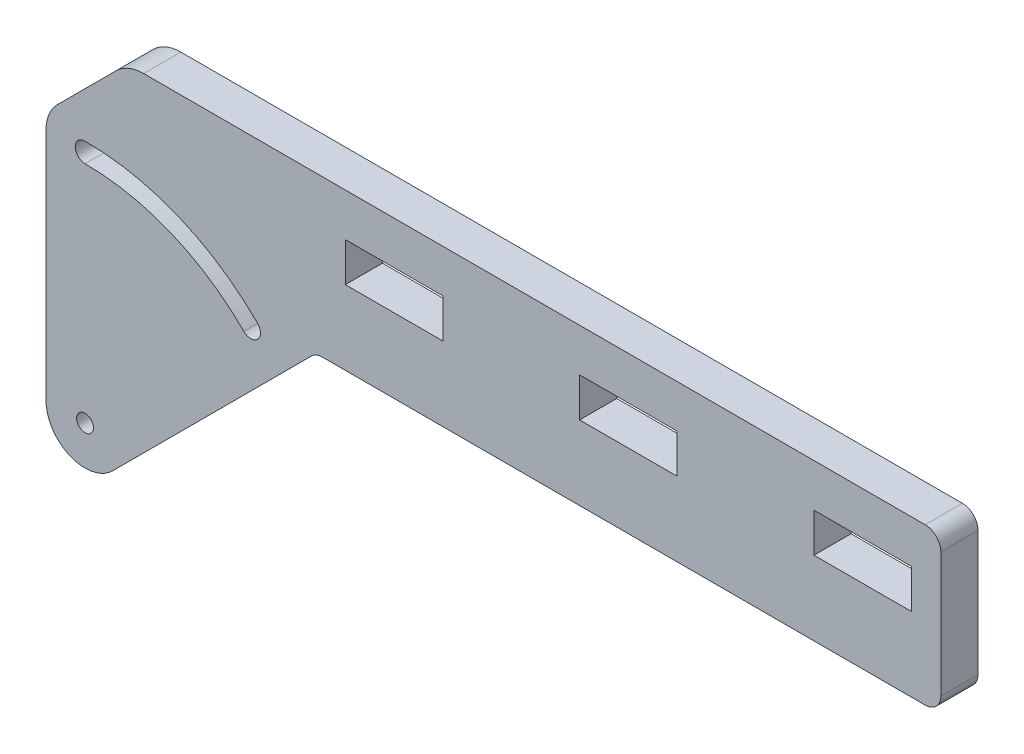
ISO-10303-21;
HEADER;
FILE_DESCRIPTION(('STEP AP214'),'2;1');
FILE_NAME('part.step','',(''),(''),'','','');
FILE_SCHEMA(('AUTOMOTIVE_DESIGN { 1 0 10303 214 1 1 1 1 }'));
ENDSEC;
DATA;
#1=APPLICATION_CONTEXT('core data for automotive mechanical design processes');
#2=APPLICATION_PROTOCOL_DEFINITION('international standard','automotive_design',2000,#1);
#3=PRODUCT_CONTEXT('',#1,'mechanical');
#4=PRODUCT('Part','Part','',(#3));
#5=PRODUCT_RELATED_PRODUCT_CATEGORY('part','',(#4));
#6=PRODUCT_DEFINITION_FORMATION('','',#4);
#7=PRODUCT_DEFINITION_CONTEXT('part definition',#1,'design');
#8=PRODUCT_DEFINITION('design','',#6,#7);
#9=PRODUCT_DEFINITION_SHAPE('','',#8);
#10=(LENGTH_UNIT() NAMED_UNIT(*) SI_UNIT(.MILLI.,.METRE.));
#11=(NAMED_UNIT(*) PLANE_ANGLE_UNIT() SI_UNIT($,.RADIAN.));
#12=(NAMED_UNIT(*) SI_UNIT($,.STERADIAN.) SOLID_ANGLE_UNIT());
#13=UNCERTAINTY_MEASURE_WITH_UNIT(LENGTH_MEASURE(1.E-05),#10,'distance_accuracy_value','');
#14=(GEOMETRIC_REPRESENTATION_CONTEXT(3) GLOBAL_UNCERTAINTY_ASSIGNED_CONTEXT((#13)) GLOBAL_UNIT_ASSIGNED_CONTEXT((#10,
#11,#12)) REPRESENTATION_CONTEXT('',''));
#15=CARTESIAN_POINT('',(0.,0.,0.));
#16=DIRECTION('',(0.,0.,1.));
#17=DIRECTION('',(1.,0.,0.));
#18=AXIS2_PLACEMENT_3D('',#15,#16,#17);
#19=CARTESIAN_POINT('',(139.155256121069,0.,6.0452));
#20=DIRECTION('',(-1.,0.,0.));
#21=DIRECTION('',(0.,0.,1.));
#22=AXIS2_PLACEMENT_3D('',#19,#20,#21);
#23=PLANE('',#22);
#24=DIRECTION('',(0.,1.,0.));
#25=VECTOR('',#24,1.);
#26=CARTESIAN_POINT('',(139.155256121069,0.,0.));
#27=LINE('',#26,#25);
#28=CARTESIAN_POINT('',(139.155256121069,31.115,0.));
#29=VERTEX_POINT('',#28);
#30=CARTESIAN_POINT('',(139.155256121069,51.435,0.));
#31=VERTEX_POINT('',#30);
#32=EDGE_CURVE('E394',#29,#31,#27,.T.);
#33=ORIENTED_EDGE('',*,*,#32,.T.);
#34=DIRECTION('',(0.,0.,-1.));
#35=VECTOR('',#34,1.);
#36=CARTESIAN_POINT('',(139.155256121069,51.435,6.0452));
#37=LINE('',#36,#35);
#38=CARTESIAN_POINT('',(139.155256121069,51.435,6.0452));
#39=VERTEX_POINT('',#38);
#40=EDGE_CURVE('E11',#39,#31,#37,.T.);
#41=ORIENTED_EDGE('',*,*,#40,.F.);
#42=DIRECTION('',(0.,1.,0.));
#43=VECTOR('',#42,1.);
#44=CARTESIAN_POINT('',(139.155256121069,0.,6.0452));
#45=LINE('',#44,#43);
#46=CARTESIAN_POINT('',(139.155256121069,31.115,6.0452));
#47=VERTEX_POINT('',#46);
#48=EDGE_CURVE('E350',#47,#39,#45,.T.);
#49=ORIENTED_EDGE('',*,*,#48,.F.);
#50=DIRECTION('',(0.,0.,-1.));
#51=VECTOR('',#50,1.);
#52=CARTESIAN_POINT('',(139.155256121069,31.115,6.0452));
#53=LINE('',#52,#51);
#54=EDGE_CURVE('E424',#47,#29,#53,.T.);
#55=ORIENTED_EDGE('',*,*,#54,.T.);
#56=EDGE_LOOP('',(#33,#41,#49,#55));
#57=FACE_BOUND('',#56,.T.);
#58=ADVANCED_FACE('F46',(#57),#23,.F.);
#59=CARTESIAN_POINT('',(136.615256121069,51.435,6.0452));
#60=DIRECTION('',(0.,0.,-1.));
#61=DIRECTION('',(-1.,0.,0.));
#62=AXIS2_PLACEMENT_3D('',#59,#60,#61);
#63=CYLINDRICAL_SURFACE('',#62,2.53999999999999);
#64=CARTESIAN_POINT('',(136.615256121069,51.435,0.));
#65=DIRECTION('',(0.,0.,1.));
#66=DIRECTION('',(1.,0.,0.));
#67=AXIS2_PLACEMENT_3D('',#64,#65,#66);
#68=CIRCLE('',#67,2.53999999999999);
#69=CARTESIAN_POINT('',(136.615256121069,53.975,0.));
#70=VERTEX_POINT('',#69);
#71=EDGE_CURVE('E397',#31,#70,#68,.T.);
#72=ORIENTED_EDGE('',*,*,#71,.T.);
#73=DIRECTION('',(0.,0.,-1.));
#74=VECTOR('',#73,1.);
#75=CARTESIAN_POINT('',(136.615256121069,53.975,6.0452));
#76=LINE('',#75,#74);
#77=CARTESIAN_POINT('',(136.615256121069,53.975,6.0452));
#78=VERTEX_POINT('',#77);
#79=EDGE_CURVE('E55',#78,#70,#76,.T.);
#80=ORIENTED_EDGE('',*,*,#79,.F.);
#81=CARTESIAN_POINT('',(136.615256121069,51.435,6.0452));
#82=DIRECTION('',(0.,0.,1.));
#83=DIRECTION('',(1.,0.,0.));
#84=AXIS2_PLACEMENT_3D('',#81,#82,#83);
#85=CIRCLE('',#84,2.53999999999999);
#86=EDGE_CURVE('E353',#39,#78,#85,.T.);
#87=ORIENTED_EDGE('',*,*,#86,.F.);
#88=ORIENTED_EDGE('',*,*,#40,.T.);
#89=EDGE_LOOP('',(#72,#80,#87,#88));
#90=FACE_BOUND('',#89,.T.);
#91=ADVANCED_FACE('F487',(#90),#63,.T.);
#92=CARTESIAN_POINT('',(0.,53.975,6.0452));
#93=DIRECTION('',(0.,-1.,0.));
#94=DIRECTION('',(1.,0.,0.));
#95=AXIS2_PLACEMENT_3D('',#92,#93,#94);
#96=PLANE('',#95);
#97=DIRECTION('',(-1.,0.,0.));
#98=VECTOR('',#97,1.);
#99=CARTESIAN_POINT('',(0.,53.975,0.));
#100=LINE('',#99,#98);
#101=CARTESIAN_POINT('',(9.52500000000008,53.975,0.));
#102=VERTEX_POINT('',#101);
#103=EDGE_CURVE('E399',#70,#102,#100,.T.);
#104=ORIENTED_EDGE('',*,*,#103,.T.);
#105=DIRECTION('',(0.,0.,-1.));
#106=VECTOR('',#105,1.);
#107=CARTESIAN_POINT('',(9.52500000000008,53.975,6.0452));
#108=LINE('',#107,#106);
#109=CARTESIAN_POINT('',(9.52500000000008,53.975,6.0452));
#110=VERTEX_POINT('',#109);
#111=EDGE_CURVE('E446',#110,#102,#108,.T.);
#112=ORIENTED_EDGE('',*,*,#111,.F.);
#113=DIRECTION('',(-1.,0.,0.));
#114=VECTOR('',#113,1.);
#115=CARTESIAN_POINT('',(0.,53.975,6.0452));
#116=LINE('',#115,#114);
#117=EDGE_CURVE('E355',#78,#110,#116,.T.);
#118=ORIENTED_EDGE('',*,*,#117,.F.);
#119=ORIENTED_EDGE('',*,*,#79,.T.);
#120=EDGE_LOOP('',(#104,#112,#118,#119));
#121=FACE_BOUND('',#120,.T.);
#122=ADVANCED_FACE('F492',(#121),#96,.F.);
#123=CARTESIAN_POINT('',(9.52500000000007,47.625,6.0452));
#124=DIRECTION('',(0.,0.,-1.));
#125=DIRECTION('',(-1.,0.,0.));
#126=AXIS2_PLACEMENT_3D('',#123,#124,#125);
#127=CYLINDRICAL_SURFACE('',#126,6.35);
#128=CARTESIAN_POINT('',(9.52500000000007,47.625,0.));
#129=DIRECTION('',(0.,0.,1.));
#130=DIRECTION('',(1.,0.,0.));
#131=AXIS2_PLACEMENT_3D('',#128,#129,#130);
#132=CIRCLE('',#131,6.35);
#133=CARTESIAN_POINT('',(5.03487193946553,52.1151280605346,0.));
#134=VERTEX_POINT('',#133);
#135=EDGE_CURVE('E402',#134,#102,#132,.F.);
#136=ORIENTED_EDGE('',*,*,#135,.F.);
#137=DIRECTION('',(0.,0.,-1.));
#138=VECTOR('',#137,1.);
#139=CARTESIAN_POINT('',(5.03487193946553,52.1151280605346,6.0452));
#140=LINE('',#139,#138);
#141=CARTESIAN_POINT('',(5.03487193946553,52.1151280605346,6.0452));
#142=VERTEX_POINT('',#141);
#143=EDGE_CURVE('E444',#142,#134,#140,.T.);
#144=ORIENTED_EDGE('',*,*,#143,.F.);
#145=CARTESIAN_POINT('',(9.52500000000007,47.625,6.0452));
#146=DIRECTION('',(0.,0.,1.));
#147=DIRECTION('',(1.,0.,0.));
#148=AXIS2_PLACEMENT_3D('',#145,#146,#147);
#149=CIRCLE('',#148,6.35);
#150=EDGE_CURVE('E357',#142,#110,#149,.F.);
#151=ORIENTED_EDGE('',*,*,#150,.T.);
#152=ORIENTED_EDGE('',*,*,#111,.T.);
#153=EDGE_LOOP('',(#136,#144,#151,#152));
#154=FACE_BOUND('',#153,.T.);
#155=ADVANCED_FACE('F530',(#154),#127,.T.);
#156=CARTESIAN_POINT('',(-23.5401280605345,23.5401280605348,6.0452));
#157=DIRECTION('',(-0.707106781186544,0.707106781186551,0.));
#158=DIRECTION('',(-0.707106781186551,-0.707106781186544,0.));
#159=AXIS2_PLACEMENT_3D('',#156,#157,#158);
#160=PLANE('',#159);
#161=DIRECTION('',(0.707106781186551,0.707106781186544,0.));
#162=VECTOR('',#161,1.);
#163=CARTESIAN_POINT('',(-23.5401280605345,23.5401280605348,0.));
#164=LINE('',#163,#162);
#165=CARTESIAN_POINT('',(-4.49012806053456,42.5901280605346,0.));
#166=VERTEX_POINT('',#165);
#167=EDGE_CURVE('E405',#166,#134,#164,.T.);
#168=ORIENTED_EDGE('',*,*,#167,.F.);
#169=DIRECTION('',(0.,0.,-1.));
#170=VECTOR('',#169,1.);
#171=CARTESIAN_POINT('',(-4.49012806053456,42.5901280605346,6.0452));
#172=LINE('',#171,#170);
#173=CARTESIAN_POINT('',(-4.49012806053456,42.5901280605346,6.0452));
#174=VERTEX_POINT('',#173);
#175=EDGE_CURVE('E442',#174,#166,#172,.T.);
#176=ORIENTED_EDGE('',*,*,#175,.F.);
#177=DIRECTION('',(0.707106781186551,0.707106781186544,0.));
#178=VECTOR('',#177,1.);
#179=CARTESIAN_POINT('',(-23.5401280605345,23.5401280605348,6.0452));
#180=LINE('',#179,#178);
#181=EDGE_CURVE('E360',#174,#142,#180,.T.);
#182=ORIENTED_EDGE('',*,*,#181,.T.);
#183=ORIENTED_EDGE('',*,*,#143,.T.);
#184=EDGE_LOOP('',(#168,#176,#182,#183));
#185=FACE_BOUND('',#184,.T.);
#186=ADVANCED_FACE('F499',(#185),#160,.T.);
#187=CARTESIAN_POINT('',(0.,38.1,6.0452));
#188=DIRECTION('',(0.,0.,-1.));
#189=DIRECTION('',(-1.,0.,0.));
#190=AXIS2_PLACEMENT_3D('',#187,#188,#189);
#191=CYLINDRICAL_SURFACE('',#190,6.34999999999999);
#192=CARTESIAN_POINT('',(0.,38.1,0.));
#193=DIRECTION('',(0.,0.,1.));
#194=DIRECTION('',(1.,0.,0.));
#195=AXIS2_PLACEMENT_3D('',#192,#193,#194);
#196=CIRCLE('',#195,6.34999999999999);
#197=CARTESIAN_POINT('',(-6.35,38.1,0.));
#198=VERTEX_POINT('',#197);
#199=EDGE_CURVE('E408',#198,#166,#196,.F.);
#200=ORIENTED_EDGE('',*,*,#199,.F.);
#201=DIRECTION('',(0.,0.,-1.));
#202=VECTOR('',#201,1.);
#203=CARTESIAN_POINT('',(-6.35,38.1,6.0452));
#204=LINE('',#203,#202);
#205=CARTESIAN_POINT('',(-6.35,38.1,6.0452));
#206=VERTEX_POINT('',#205);
#207=EDGE_CURVE('E440',#206,#198,#204,.T.);
#208=ORIENTED_EDGE('',*,*,#207,.F.);
#209=CARTESIAN_POINT('',(0.,38.1,6.0452));
#210=DIRECTION('',(0.,0.,1.));
#211=DIRECTION('',(1.,0.,0.));
#212=AXIS2_PLACEMENT_3D('',#209,#210,#211);
#213=CIRCLE('',#212,6.34999999999999);
#214=EDGE_CURVE('E363',#206,#174,#213,.F.);
#215=ORIENTED_EDGE('',*,*,#214,.T.);
#216=ORIENTED_EDGE('',*,*,#175,.T.);
#217=EDGE_LOOP('',(#200,#208,#215,#216));
#218=FACE_BOUND('',#217,.T.);
#219=ADVANCED_FACE('F503',(#218),#191,.T.);
#220=CARTESIAN_POINT('',(-6.35,0.,6.0452));
#221=DIRECTION('',(1.,0.,0.));
#222=DIRECTION('',(0.,1.,0.));
#223=AXIS2_PLACEMENT_3D('',#220,#221,#222);
#224=PLANE('',#223);
#225=DIRECTION('',(0.,-1.,0.));
#226=VECTOR('',#225,1.);
#227=CARTESIAN_POINT('',(-6.35,0.,0.));
#228=LINE('',#227,#226);
#229=CARTESIAN_POINT('',(-6.35,0.,0.));
#230=VERTEX_POINT('',#229);
#231=EDGE_CURVE('E411',#198,#230,#228,.T.);
#232=ORIENTED_EDGE('',*,*,#231,.T.);
#233=DIRECTION('',(0.,0.,-1.));
#234=VECTOR('',#233,1.);
#235=CARTESIAN_POINT('',(-6.35,0.,6.0452));
#236=LINE('',#235,#234);
#237=CARTESIAN_POINT('',(-6.35,0.,6.0452));
#238=VERTEX_POINT('',#237);
#239=EDGE_CURVE('E437',#238,#230,#236,.T.);
#240=ORIENTED_EDGE('',*,*,#239,.F.);
#241=DIRECTION('',(0.,-1.,0.));
#242=VECTOR('',#241,1.);
#243=CARTESIAN_POINT('',(-6.35,0.,6.0452));
#244=LINE('',#243,#242);
#245=EDGE_CURVE('E366',#206,#238,#244,.T.);
#246=ORIENTED_EDGE('',*,*,#245,.F.);
#247=ORIENTED_EDGE('',*,*,#207,.T.);
#248=EDGE_LOOP('',(#232,#240,#246,#247));
#249=FACE_BOUND('',#248,.T.);
#250=ADVANCED_FACE('F509',(#249),#224,.F.);
#251=CARTESIAN_POINT('',(0.,0.,6.0452));
#252=DIRECTION('',(0.,0.,-1.));
#253=DIRECTION('',(-1.,0.,0.));
#254=AXIS2_PLACEMENT_3D('',#251,#252,#253);
#255=CYLINDRICAL_SURFACE('',#254,6.35);
#256=CARTESIAN_POINT('',(0.,0.,0.));
#257=DIRECTION('',(0.,0.,1.));
#258=DIRECTION('',(1.,0.,0.));
#259=AXIS2_PLACEMENT_3D('',#256,#257,#258);
#260=CIRCLE('',#259,6.35);
#261=CARTESIAN_POINT('',(4.49012806053458,-4.49012806053457,0.));
#262=VERTEX_POINT('',#261);
#263=EDGE_CURVE('E413',#230,#262,#260,.T.);
#264=ORIENTED_EDGE('',*,*,#263,.T.);
#265=DIRECTION('',(0.,0.,-1.));
#266=VECTOR('',#265,1.);
#267=CARTESIAN_POINT('',(4.49012806053458,-4.49012806053457,6.0452));
#268=LINE('',#267,#266);
#269=CARTESIAN_POINT('',(4.49012806053458,-4.49012806053457,6.0452));
#270=VERTEX_POINT('',#269);
#271=EDGE_CURVE('E434',#270,#262,#268,.T.);
#272=ORIENTED_EDGE('',*,*,#271,.F.);
#273=CARTESIAN_POINT('',(0.,0.,6.0452));
#274=DIRECTION('',(0.,0.,1.));
#275=DIRECTION('',(1.,0.,0.));
#276=AXIS2_PLACEMENT_3D('',#273,#274,#275);
#277=CIRCLE('',#276,6.35);
#278=EDGE_CURVE('E368',#238,#270,#277,.T.);
#279=ORIENTED_EDGE('',*,*,#278,.F.);
#280=ORIENTED_EDGE('',*,*,#239,.T.);
#281=EDGE_LOOP('',(#264,#272,#279,#280));
#282=FACE_BOUND('',#281,.T.);
#283=ADVANCED_FACE('F513',(#282),#255,.T.);
#284=CARTESIAN_POINT('',(4.49012806053458,-4.49012806053457,6.0452));
#285=DIRECTION('',(-0.707106781186549,0.707106781186546,0.));
#286=DIRECTION('',(-0.707106781186546,-0.707106781186549,0.));
#287=AXIS2_PLACEMENT_3D('',#284,#285,#286);
#288=PLANE('',#287);
#289=DIRECTION('',(0.707106781186546,0.707106781186549,0.));
#290=VECTOR('',#289,1.);
#291=CARTESIAN_POINT('',(4.49012806053458,-4.49012806053457,0.));
#292=LINE('',#291,#290);
#293=CARTESIAN_POINT('',(36.811307345283,27.8310512242138,0.));
#294=VERTEX_POINT('',#293);
#295=EDGE_CURVE('E415',#262,#294,#292,.T.);
#296=ORIENTED_EDGE('',*,*,#295,.T.);
#297=DIRECTION('',(0.,0.,-1.));
#298=VECTOR('',#297,1.);
#299=CARTESIAN_POINT('',(36.811307345283,27.8310512242138,6.0452));
#300=LINE('',#299,#298);
#301=CARTESIAN_POINT('',(36.811307345283,27.8310512242138,6.0452));
#302=VERTEX_POINT('',#301);
#303=EDGE_CURVE('E432',#302,#294,#300,.T.);
#304=ORIENTED_EDGE('',*,*,#303,.F.);
#305=DIRECTION('',(0.707106781186546,0.707106781186549,0.));
#306=VECTOR('',#305,1.);
#307=CARTESIAN_POINT('',(4.49012806053458,-4.49012806053457,6.0452));
#308=LINE('',#307,#306);
#309=EDGE_CURVE('E370',#270,#302,#308,.T.);
#310=ORIENTED_EDGE('',*,*,#309,.F.);
#311=ORIENTED_EDGE('',*,*,#271,.T.);
#312=EDGE_LOOP('',(#296,#304,#310,#311));
#313=FACE_BOUND('',#312,.T.);
#314=ADVANCED_FACE('F518',(#313),#288,.F.);
#315=CARTESIAN_POINT('',(38.6073585694968,26.035,6.0452));
#316=DIRECTION('',(0.,0.,-1.));
#317=DIRECTION('',(-1.,0.,0.));
#318=AXIS2_PLACEMENT_3D('',#315,#316,#317);
#319=CYLINDRICAL_SURFACE('',#318,2.54);
#320=CARTESIAN_POINT('',(38.6073585694968,26.035,0.));
#321=DIRECTION('',(0.,0.,1.));
#322=DIRECTION('',(1.,0.,0.));
#323=AXIS2_PLACEMENT_3D('',#320,#321,#322);
#324=CIRCLE('',#323,2.54);
#325=CARTESIAN_POINT('',(38.6073585694968,28.575,0.));
#326=VERTEX_POINT('',#325);
#327=EDGE_CURVE('E418',#326,#294,#324,.T.);
#328=ORIENTED_EDGE('',*,*,#327,.F.);
#329=DIRECTION('',(0.,0.,-1.));
#330=VECTOR('',#329,1.);
#331=CARTESIAN_POINT('',(38.6073585694968,28.575,6.0452));
#332=LINE('',#331,#330);
#333=CARTESIAN_POINT('',(38.6073585694968,28.575,6.0452));
#334=VERTEX_POINT('',#333);
#335=EDGE_CURVE('E430',#334,#326,#332,.T.);
#336=ORIENTED_EDGE('',*,*,#335,.F.);
#337=CARTESIAN_POINT('',(38.6073585694968,26.035,6.0452));
#338=DIRECTION('',(0.,0.,1.));
#339=DIRECTION('',(1.,0.,0.));
#340=AXIS2_PLACEMENT_3D('',#337,#338,#339);
#341=CIRCLE('',#340,2.54);
#342=EDGE_CURVE('E372',#334,#302,#341,.T.);
#343=ORIENTED_EDGE('',*,*,#342,.T.);
#344=ORIENTED_EDGE('',*,*,#303,.T.);
#345=EDGE_LOOP('',(#328,#336,#343,#344));
#346=FACE_BOUND('',#345,.T.);
#347=ADVANCED_FACE('F524',(#346),#319,.F.);
#348=CARTESIAN_POINT('',(0.,28.575,6.0452));
#349=DIRECTION('',(0.,1.,0.));
#350=DIRECTION('',(0.,0.,1.));
#351=AXIS2_PLACEMENT_3D('',#348,#349,#350);
#352=PLANE('',#351);
#353=DIRECTION('',(1.,0.,0.));
#354=VECTOR('',#353,1.);
#355=CARTESIAN_POINT('',(0.,28.575,0.));
#356=LINE('',#355,#354);
#357=CARTESIAN_POINT('',(136.615256121069,28.575,0.));
#358=VERTEX_POINT('',#357);
#359=EDGE_CURVE('E421',#326,#358,#356,.T.);
#360=ORIENTED_EDGE('',*,*,#359,.T.);
#361=DIRECTION('',(0.,0.,-1.));
#362=VECTOR('',#361,1.);
#363=CARTESIAN_POINT('',(136.615256121069,28.575,6.0452));
#364=LINE('',#363,#362);
#365=CARTESIAN_POINT('',(136.615256121069,28.575,6.0452));
#366=VERTEX_POINT('',#365);
#367=EDGE_CURVE('E427',#366,#358,#364,.T.);
#368=ORIENTED_EDGE('',*,*,#367,.F.);
#369=DIRECTION('',(1.,0.,0.));
#370=VECTOR('',#369,1.);
#371=CARTESIAN_POINT('',(0.,28.575,6.0452));
#372=LINE('',#371,#370);
#373=EDGE_CURVE('E375',#334,#366,#372,.T.);
#374=ORIENTED_EDGE('',*,*,#373,.F.);
#375=ORIENTED_EDGE('',*,*,#335,.T.);
#376=EDGE_LOOP('',(#360,#368,#374,#375));
#377=FACE_BOUND('',#376,.T.);
#378=ADVANCED_FACE('F527',(#377),#352,.F.);
#379=CARTESIAN_POINT('',(0.,38.1,6.0452));
#380=DIRECTION('',(0.,0.,-1.));
#381=DIRECTION('',(-1.,0.,0.));
#382=AXIS2_PLACEMENT_3D('',#379,#380,#381);
#383=CYLINDRICAL_SURFACE('',#382,1.58750000000001);
#384=CARTESIAN_POINT('',(0.,38.1,0.));
#385=DIRECTION('',(0.,0.,1.));
#386=DIRECTION('',(1.,0.,0.));
#387=AXIS2_PLACEMENT_3D('',#384,#385,#386);
#388=CIRCLE('',#387,1.58750000000001);
#389=CARTESIAN_POINT('',(0.,39.6875,0.));
#390=VERTEX_POINT('',#389);
#391=CARTESIAN_POINT('',(0.,36.5125,0.));
#392=VERTEX_POINT('',#391);
#393=EDGE_CURVE('E382',#390,#392,#388,.T.);
#394=ORIENTED_EDGE('',*,*,#393,.F.);
#395=DIRECTION('',(0.,0.,-1.));
#396=VECTOR('',#395,1.);
#397=CARTESIAN_POINT('',(0.,39.6875,6.0452));
#398=LINE('',#397,#396);
#399=CARTESIAN_POINT('',(0.,39.6875,6.0452));
#400=VERTEX_POINT('',#399);
#401=EDGE_CURVE('E50',#400,#390,#398,.T.);
#402=ORIENTED_EDGE('',*,*,#401,.F.);
#403=CARTESIAN_POINT('',(0.,38.1,6.0452));
#404=DIRECTION('',(0.,0.,1.));
#405=DIRECTION('',(1.,0.,0.));
#406=AXIS2_PLACEMENT_3D('',#403,#404,#405);
#407=CIRCLE('',#406,1.58750000000001);
#408=CARTESIAN_POINT('',(0.,36.5125,6.0452));
#409=VERTEX_POINT('',#408);
#410=EDGE_CURVE('E338',#400,#409,#407,.T.);
#411=ORIENTED_EDGE('',*,*,#410,.T.);
#412=DIRECTION('',(0.,0.,-1.));
#413=VECTOR('',#412,1.);
#414=CARTESIAN_POINT('',(0.,36.5125,6.0452));
#415=LINE('',#414,#413);
#416=EDGE_CURVE('E379',#409,#392,#415,.T.);
#417=ORIENTED_EDGE('',*,*,#416,.T.);
#418=EDGE_LOOP('',(#394,#402,#411,#417));
#419=FACE_BOUND('',#418,.T.);
#420=ADVANCED_FACE('F462',(#419),#383,.F.);
#421=CARTESIAN_POINT('',(0.,0.,6.0452));
#422=DIRECTION('',(0.,0.,-1.));
#423=DIRECTION('',(-1.,0.,0.));
#424=AXIS2_PLACEMENT_3D('',#421,#422,#423);
#425=CYLINDRICAL_SURFACE('',#424,39.6875);
#426=CARTESIAN_POINT('',(0.,0.,0.));
#427=DIRECTION('',(0.,0.,1.));
#428=DIRECTION('',(1.,0.,0.));
#429=AXIS2_PLACEMENT_3D('',#426,#427,#428);
#430=CIRCLE('',#429,39.6875);
#431=CARTESIAN_POINT('',(28.0633003783411,28.0633003783412,0.));
#432=VERTEX_POINT('',#431);
#433=EDGE_CURVE('E385',#432,#390,#430,.T.);
#434=ORIENTED_EDGE('',*,*,#433,.F.);
#435=DIRECTION('',(0.,0.,-1.));
#436=VECTOR('',#435,1.);
#437=CARTESIAN_POINT('',(28.0633003783411,28.0633003783412,6.0452));
#438=LINE('',#437,#436);
#439=CARTESIAN_POINT('',(28.0633003783411,28.0633003783412,6.0452));
#440=VERTEX_POINT('',#439);
#441=EDGE_CURVE('E452',#440,#432,#438,.T.);
#442=ORIENTED_EDGE('',*,*,#441,.F.);
#443=CARTESIAN_POINT('',(0.,0.,6.0452));
#444=DIRECTION('',(0.,0.,1.));
#445=DIRECTION('',(1.,0.,0.));
#446=AXIS2_PLACEMENT_3D('',#443,#444,#445);
#447=CIRCLE('',#446,39.6875);
#448=EDGE_CURVE('E342',#440,#400,#447,.T.);
#449=ORIENTED_EDGE('',*,*,#448,.T.);
#450=ORIENTED_EDGE('',*,*,#401,.T.);
#451=EDGE_LOOP('',(#434,#442,#449,#450));
#452=FACE_BOUND('',#451,.T.);
#453=ADVANCED_FACE('F458',(#452),#425,.F.);
#454=CARTESIAN_POINT('',(26.9407683632074,26.9407683632075,6.0452));
#455=DIRECTION('',(0.,0.,-1.));
#456=DIRECTION('',(-1.,0.,0.));
#457=AXIS2_PLACEMENT_3D('',#454,#455,#456);
#458=CYLINDRICAL_SURFACE('',#457,1.5875);
#459=CARTESIAN_POINT('',(26.9407683632074,26.9407683632075,0.));
#460=DIRECTION('',(0.,0.,1.));
#461=DIRECTION('',(1.,0.,0.));
#462=AXIS2_PLACEMENT_3D('',#459,#460,#461);
#463=CIRCLE('',#462,1.5875);
#464=CARTESIAN_POINT('',(25.8182363480738,25.8182363480739,0.));
#465=VERTEX_POINT('',#464);
#466=EDGE_CURVE('E388',#465,#432,#463,.T.);
#467=ORIENTED_EDGE('',*,*,#466,.F.);
#468=DIRECTION('',(0.,0.,-1.));
#469=VECTOR('',#468,1.);
#470=CARTESIAN_POINT('',(25.8182363480738,25.8182363480739,6.0452));
#471=LINE('',#470,#469);
#472=CARTESIAN_POINT('',(25.8182363480738,25.8182363480739,6.0452));
#473=VERTEX_POINT('',#472);
#474=EDGE_CURVE('E451',#473,#465,#471,.T.);
#475=ORIENTED_EDGE('',*,*,#474,.F.);
#476=CARTESIAN_POINT('',(26.9407683632074,26.9407683632075,6.0452));
#477=DIRECTION('',(0.,0.,1.));
#478=DIRECTION('',(1.,0.,0.));
#479=AXIS2_PLACEMENT_3D('',#476,#477,#478);
#480=CIRCLE('',#479,1.5875);
#481=EDGE_CURVE('E345',#473,#440,#480,.T.);
#482=ORIENTED_EDGE('',*,*,#481,.T.);
#483=ORIENTED_EDGE('',*,*,#441,.T.);
#484=EDGE_LOOP('',(#467,#475,#482,#483));
#485=FACE_BOUND('',#484,.T.);
#486=ADVANCED_FACE('F467',(#485),#458,.F.);
#487=CARTESIAN_POINT('',(0.,0.,6.0452));
#488=DIRECTION('',(0.,0.,-1.));
#489=DIRECTION('',(-1.,0.,0.));
#490=AXIS2_PLACEMENT_3D('',#487,#488,#489);
#491=CYLINDRICAL_SURFACE('',#490,36.5125);
#492=CARTESIAN_POINT('',(0.,0.,0.));
#493=DIRECTION('',(0.,0.,1.));
#494=DIRECTION('',(1.,0.,0.));
#495=AXIS2_PLACEMENT_3D('',#492,#493,#494);
#496=CIRCLE('',#495,36.5125);
#497=EDGE_CURVE('E391',#465,#392,#496,.T.);
#498=ORIENTED_EDGE('',*,*,#497,.T.);
#499=ORIENTED_EDGE('',*,*,#416,.F.);
#500=CARTESIAN_POINT('',(0.,0.,6.0452));
#501=DIRECTION('',(0.,0.,1.));
#502=DIRECTION('',(1.,0.,0.));
#503=AXIS2_PLACEMENT_3D('',#500,#501,#502);
#504=CIRCLE('',#503,36.5125);
#505=EDGE_CURVE('E348',#473,#409,#504,.T.);
#506=ORIENTED_EDGE('',*,*,#505,.F.);
#507=ORIENTED_EDGE('',*,*,#474,.T.);
#508=EDGE_LOOP('',(#498,#499,#506,#507));
#509=FACE_BOUND('',#508,.T.);
#510=ADVANCED_FACE('F471',(#509),#491,.T.);
#511=CARTESIAN_POINT('',(0.,0.,6.0452));
#512=DIRECTION('',(0.,0.,-1.));
#513=DIRECTION('',(-1.,0.,0.));
#514=AXIS2_PLACEMENT_3D('',#511,#512,#513);
#515=CYLINDRICAL_SURFACE('',#514,1.3716);
#516=CARTESIAN_POINT('',(0.,0.,6.0452));
#517=DIRECTION('',(0.,0.,1.));
#518=DIRECTION('',(1.,0.,0.));
#519=AXIS2_PLACEMENT_3D('',#516,#517,#518);
#520=CIRCLE('',#519,1.3716);
#521=CARTESIAN_POINT('',(1.3716,0.,6.0452));
#522=VERTEX_POINT('',#521);
#523=EDGE_CURVE('E335',#522,#522,#520,.T.);
#524=ORIENTED_EDGE('',*,*,#523,.T.);
#525=EDGE_LOOP('',(#524));
#526=FACE_BOUND('',#525,.T.);
#527=CARTESIAN_POINT('',(0.,0.,0.));
#528=DIRECTION('',(0.,0.,1.));
#529=DIRECTION('',(1.,0.,0.));
#530=AXIS2_PLACEMENT_3D('',#527,#528,#529);
#531=CIRCLE('',#530,1.3716);
#532=CARTESIAN_POINT('',(1.3716,0.,0.));
#533=VERTEX_POINT('',#532);
#534=EDGE_CURVE('E269',#533,#533,#531,.T.);
#535=ORIENTED_EDGE('',*,*,#534,.F.);
#536=EDGE_LOOP('',(#535));
#537=FACE_BOUND('',#536,.T.);
#538=ADVANCED_FACE('F48',(#526,#537),#515,.F.);
#539=CARTESIAN_POINT('',(136.615256121069,31.115,6.0452));
#540=DIRECTION('',(0.,0.,-1.));
#541=DIRECTION('',(-1.,0.,0.));
#542=AXIS2_PLACEMENT_3D('',#539,#540,#541);
#543=CYLINDRICAL_SURFACE('',#542,2.53999999999999);
#544=CARTESIAN_POINT('',(136.615256121069,31.115,0.));
#545=DIRECTION('',(0.,0.,1.));
#546=DIRECTION('',(1.,0.,0.));
#547=AXIS2_PLACEMENT_3D('',#544,#545,#546);
#548=CIRCLE('',#547,2.53999999999999);
#549=EDGE_CURVE('E339',#358,#29,#548,.T.);
#550=ORIENTED_EDGE('',*,*,#549,.T.);
#551=ORIENTED_EDGE('',*,*,#54,.F.);
#552=CARTESIAN_POINT('',(136.615256121069,31.115,6.0452));
#553=DIRECTION('',(0.,0.,1.));
#554=DIRECTION('',(1.,0.,0.));
#555=AXIS2_PLACEMENT_3D('',#552,#553,#554);
#556=CIRCLE('',#555,2.53999999999999);
#557=EDGE_CURVE('E377',#366,#47,#556,.T.);
#558=ORIENTED_EDGE('',*,*,#557,.F.);
#559=ORIENTED_EDGE('',*,*,#367,.T.);
#560=EDGE_LOOP('',(#550,#551,#558,#559));
#561=FACE_BOUND('',#560,.T.);
#562=ADVANCED_FACE('F476',(#561),#543,.T.);
#563=CARTESIAN_POINT('',(0.,0.,6.0452));
#564=DIRECTION('',(0.,0.,1.));
#565=DIRECTION('',(1.,0.,0.));
#566=AXIS2_PLACEMENT_3D('',#563,#564,#565);
#567=PLANE('',#566);
#568=DIRECTION('',(0.,-1.,0.));
#569=VECTOR('',#568,1.);
#570=CARTESIAN_POINT('',(118.517756121069,46.99,6.0452));
#571=LINE('',#570,#569);
#572=CARTESIAN_POINT('',(118.517756121069,46.99,6.0452));
#573=VERTEX_POINT('',#572);
#574=CARTESIAN_POINT('',(118.517756121069,40.64,6.0452));
#575=VERTEX_POINT('',#574);
#576=EDGE_CURVE('E63',#573,#575,#571,.T.);
#577=ORIENTED_EDGE('',*,*,#576,.F.);
#578=DIRECTION('',(-1.,0.,0.));
#579=VECTOR('',#578,1.);
#580=CARTESIAN_POINT('',(118.517756121069,46.99,6.0452));
#581=LINE('',#580,#579);
#582=CARTESIAN_POINT('',(134.392756121069,46.99,6.0452));
#583=VERTEX_POINT('',#582);
#584=EDGE_CURVE('E254',#583,#573,#581,.T.);
#585=ORIENTED_EDGE('',*,*,#584,.F.);
#586=DIRECTION('',(0.,1.,0.));
#587=VECTOR('',#586,1.);
#588=CARTESIAN_POINT('',(134.392756121069,46.99,6.0452));
#589=LINE('',#588,#587);
#590=CARTESIAN_POINT('',(134.392756121069,40.64,6.0452));
#591=VERTEX_POINT('',#590);
#592=EDGE_CURVE('E257',#591,#583,#589,.T.);
#593=ORIENTED_EDGE('',*,*,#592,.F.);
#594=DIRECTION('',(1.,0.,0.));
#595=VECTOR('',#594,1.);
#596=CARTESIAN_POINT('',(118.517756121069,40.64,6.0452));
#597=LINE('',#596,#595);
#598=EDGE_CURVE('E263',#575,#591,#597,.T.);
#599=ORIENTED_EDGE('',*,*,#598,.F.);
#600=EDGE_LOOP('',(#577,#585,#593,#599));
#601=FACE_BOUND('',#600,.T.);
#602=DIRECTION('',(-1.,0.,0.));
#603=VECTOR('',#602,1.);
#604=CARTESIAN_POINT('',(80.4177561210691,46.99,6.0452));
#605=LINE('',#604,#603);
#606=CARTESIAN_POINT('',(96.2927561210691,46.99,6.0452));
#607=VERTEX_POINT('',#606);
#608=CARTESIAN_POINT('',(80.4177561210691,46.99,6.0452));
#609=VERTEX_POINT('',#608);
#610=EDGE_CURVE('E71',#607,#609,#605,.T.);
#611=ORIENTED_EDGE('',*,*,#610,.F.);
#612=DIRECTION('',(0.,1.,0.));
#613=VECTOR('',#612,1.);
#614=CARTESIAN_POINT('',(96.2927561210691,46.99,6.0452));
#615=LINE('',#614,#613);
#616=CARTESIAN_POINT('',(96.2927561210691,40.64,6.0452));
#617=VERTEX_POINT('',#616);
#618=EDGE_CURVE('E283',#617,#607,#615,.T.);
#619=ORIENTED_EDGE('',*,*,#618,.F.);
#620=DIRECTION('',(1.,0.,0.));
#621=VECTOR('',#620,1.);
#622=CARTESIAN_POINT('',(80.4177561210691,40.64,6.0452));
#623=LINE('',#622,#621);
#624=CARTESIAN_POINT('',(80.4177561210691,40.64,6.0452));
#625=VERTEX_POINT('',#624);
#626=EDGE_CURVE('E286',#625,#617,#623,.T.);
#627=ORIENTED_EDGE('',*,*,#626,.F.);
#628=DIRECTION('',(0.,-1.,0.));
#629=VECTOR('',#628,1.);
#630=CARTESIAN_POINT('',(80.4177561210691,46.99,6.0452));
#631=LINE('',#630,#629);
#632=EDGE_CURVE('E290',#609,#625,#631,.T.);
#633=ORIENTED_EDGE('',*,*,#632,.F.);
#634=EDGE_LOOP('',(#611,#619,#627,#633));
#635=FACE_BOUND('',#634,.T.);
#636=DIRECTION('',(-1.,0.,0.));
#637=VECTOR('',#636,1.);
#638=CARTESIAN_POINT('',(42.3177561210691,46.99,6.0452));
#639=LINE('',#638,#637);
#640=CARTESIAN_POINT('',(58.1927561210691,46.99,6.0452));
#641=VERTEX_POINT('',#640);
#642=CARTESIAN_POINT('',(42.3177561210691,46.99,6.0452));
#643=VERTEX_POINT('',#642);
#644=EDGE_CURVE('E282',#641,#643,#639,.T.);
#645=ORIENTED_EDGE('',*,*,#644,.F.);
#646=DIRECTION('',(0.,1.,0.));
#647=VECTOR('',#646,1.);
#648=CARTESIAN_POINT('',(58.1927561210691,46.99,6.0452));
#649=LINE('',#648,#647);
#650=CARTESIAN_POINT('',(58.1927561210691,40.64,6.0452));
#651=VERTEX_POINT('',#650);
#652=EDGE_CURVE('E314',#651,#641,#649,.T.);
#653=ORIENTED_EDGE('',*,*,#652,.F.);
#654=DIRECTION('',(1.,0.,0.));
#655=VECTOR('',#654,1.);
#656=CARTESIAN_POINT('',(42.3177561210691,40.64,6.0452));
#657=LINE('',#656,#655);
#658=CARTESIAN_POINT('',(42.3177561210691,40.64,6.0452));
#659=VERTEX_POINT('',#658);
#660=EDGE_CURVE('E317',#659,#651,#657,.T.);
#661=ORIENTED_EDGE('',*,*,#660,.F.);
#662=DIRECTION('',(0.,-1.,0.));
#663=VECTOR('',#662,1.);
#664=CARTESIAN_POINT('',(42.3177561210691,46.99,6.0452));
#665=LINE('',#664,#663);
#666=EDGE_CURVE('E321',#643,#659,#665,.T.);
#667=ORIENTED_EDGE('',*,*,#666,.F.);
#668=EDGE_LOOP('',(#645,#653,#661,#667));
#669=FACE_BOUND('',#668,.T.);
#670=ORIENTED_EDGE('',*,*,#523,.F.);
#671=EDGE_LOOP('',(#670));
#672=FACE_BOUND('',#671,.T.);
#673=ORIENTED_EDGE('',*,*,#410,.F.);
#674=ORIENTED_EDGE('',*,*,#448,.F.);
#675=ORIENTED_EDGE('',*,*,#481,.F.);
#676=ORIENTED_EDGE('',*,*,#505,.T.);
#677=EDGE_LOOP('',(#673,#674,#675,#676));
#678=FACE_BOUND('',#677,.T.);
#679=ORIENTED_EDGE('',*,*,#48,.T.);
#680=ORIENTED_EDGE('',*,*,#86,.T.);
#681=ORIENTED_EDGE('',*,*,#117,.T.);
#682=ORIENTED_EDGE('',*,*,#150,.F.);
#683=ORIENTED_EDGE('',*,*,#181,.F.);
#684=ORIENTED_EDGE('',*,*,#214,.F.);
#685=ORIENTED_EDGE('',*,*,#245,.T.);
#686=ORIENTED_EDGE('',*,*,#278,.T.);
#687=ORIENTED_EDGE('',*,*,#309,.T.);
#688=ORIENTED_EDGE('',*,*,#342,.F.);
#689=ORIENTED_EDGE('',*,*,#373,.T.);
#690=ORIENTED_EDGE('',*,*,#557,.T.);
#691=EDGE_LOOP('',(#679,#680,#681,#682,#683,#684,#685,#686,#687,#688,#689,#690));
#692=FACE_BOUND('',#691,.T.);
#693=ADVANCED_FACE('F473',(#601,#635,#669,#672,#678,#692),#567,.T.);
#694=CARTESIAN_POINT('',(0.,0.,0.));
#695=DIRECTION('',(0.,0.,1.));
#696=DIRECTION('',(1.,0.,0.));
#697=AXIS2_PLACEMENT_3D('',#694,#695,#696);
#698=PLANE('',#697);
#699=DIRECTION('',(-1.,0.,0.));
#700=VECTOR('',#699,1.);
#701=CARTESIAN_POINT('',(118.517756121069,46.99,0.));
#702=LINE('',#701,#700);
#703=CARTESIAN_POINT('',(134.392756121069,46.99,0.));
#704=VERTEX_POINT('',#703);
#705=CARTESIAN_POINT('',(118.517756121069,46.99,0.));
#706=VERTEX_POINT('',#705);
#707=EDGE_CURVE('E241',#704,#706,#702,.T.);
#708=ORIENTED_EDGE('',*,*,#707,.T.);
#709=DIRECTION('',(0.,-1.,0.));
#710=VECTOR('',#709,1.);
#711=CARTESIAN_POINT('',(118.517756121069,46.99,0.));
#712=LINE('',#711,#710);
#713=CARTESIAN_POINT('',(118.517756121069,40.64,0.));
#714=VERTEX_POINT('',#713);
#715=EDGE_CURVE('E235',#706,#714,#712,.T.);
#716=ORIENTED_EDGE('',*,*,#715,.T.);
#717=DIRECTION('',(1.,0.,0.));
#718=VECTOR('',#717,1.);
#719=CARTESIAN_POINT('',(118.517756121069,40.64,0.));
#720=LINE('',#719,#718);
#721=CARTESIAN_POINT('',(134.392756121069,40.64,0.));
#722=VERTEX_POINT('',#721);
#723=EDGE_CURVE('E245',#714,#722,#720,.T.);
#724=ORIENTED_EDGE('',*,*,#723,.T.);
#725=DIRECTION('',(0.,1.,0.));
#726=VECTOR('',#725,1.);
#727=CARTESIAN_POINT('',(134.392756121069,46.99,0.));
#728=LINE('',#727,#726);
#729=EDGE_CURVE('E249',#722,#704,#728,.T.);
#730=ORIENTED_EDGE('',*,*,#729,.T.);
#731=EDGE_LOOP('',(#708,#716,#724,#730));
#732=FACE_BOUND('',#731,.T.);
#733=DIRECTION('',(0.,1.,0.));
#734=VECTOR('',#733,1.);
#735=CARTESIAN_POINT('',(96.2927561210691,46.99,0.));
#736=LINE('',#735,#734);
#737=CARTESIAN_POINT('',(96.2927561210691,40.64,0.));
#738=VERTEX_POINT('',#737);
#739=CARTESIAN_POINT('',(96.2927561210691,46.99,0.));
#740=VERTEX_POINT('',#739);
#741=EDGE_CURVE('E275',#738,#740,#736,.T.);
#742=ORIENTED_EDGE('',*,*,#741,.T.);
#743=DIRECTION('',(-1.,0.,0.));
#744=VECTOR('',#743,1.);
#745=CARTESIAN_POINT('',(80.4177561210691,46.99,0.));
#746=LINE('',#745,#744);
#747=CARTESIAN_POINT('',(80.4177561210691,46.99,0.));
#748=VERTEX_POINT('',#747);
#749=EDGE_CURVE('E287',#740,#748,#746,.T.);
#750=ORIENTED_EDGE('',*,*,#749,.T.);
#751=DIRECTION('',(0.,-1.,0.));
#752=VECTOR('',#751,1.);
#753=CARTESIAN_POINT('',(80.4177561210691,46.99,0.));
#754=LINE('',#753,#752);
#755=CARTESIAN_POINT('',(80.4177561210691,40.64,0.));
#756=VERTEX_POINT('',#755);
#757=EDGE_CURVE('E299',#748,#756,#754,.T.);
#758=ORIENTED_EDGE('',*,*,#757,.T.);
#759=DIRECTION('',(1.,0.,0.));
#760=VECTOR('',#759,1.);
#761=CARTESIAN_POINT('',(80.4177561210691,40.64,0.));
#762=LINE('',#761,#760);
#763=EDGE_CURVE('E296',#756,#738,#762,.T.);
#764=ORIENTED_EDGE('',*,*,#763,.T.);
#765=EDGE_LOOP('',(#742,#750,#758,#764));
#766=FACE_BOUND('',#765,.T.);
#767=DIRECTION('',(0.,1.,0.));
#768=VECTOR('',#767,1.);
#769=CARTESIAN_POINT('',(58.1927561210691,46.99,0.));
#770=LINE('',#769,#768);
#771=CARTESIAN_POINT('',(58.1927561210691,40.64,0.));
#772=VERTEX_POINT('',#771);
#773=CARTESIAN_POINT('',(58.1927561210691,46.99,0.));
#774=VERTEX_POINT('',#773);
#775=EDGE_CURVE('E307',#772,#774,#770,.T.);
#776=ORIENTED_EDGE('',*,*,#775,.T.);
#777=DIRECTION('',(-1.,0.,0.));
#778=VECTOR('',#777,1.);
#779=CARTESIAN_POINT('',(42.3177561210691,46.99,0.));
#780=LINE('',#779,#778);
#781=CARTESIAN_POINT('',(42.3177561210691,46.99,0.));
#782=VERTEX_POINT('',#781);
#783=EDGE_CURVE('E318',#774,#782,#780,.T.);
#784=ORIENTED_EDGE('',*,*,#783,.T.);
#785=DIRECTION('',(0.,-1.,0.));
#786=VECTOR('',#785,1.);
#787=CARTESIAN_POINT('',(42.3177561210691,46.99,0.));
#788=LINE('',#787,#786);
#789=CARTESIAN_POINT('',(42.3177561210691,40.64,0.));
#790=VERTEX_POINT('',#789);
#791=EDGE_CURVE('E330',#782,#790,#788,.T.);
#792=ORIENTED_EDGE('',*,*,#791,.T.);
#793=DIRECTION('',(1.,0.,0.));
#794=VECTOR('',#793,1.);
#795=CARTESIAN_POINT('',(42.3177561210691,40.64,0.));
#796=LINE('',#795,#794);
#797=EDGE_CURVE('E327',#790,#772,#796,.T.);
#798=ORIENTED_EDGE('',*,*,#797,.T.);
#799=EDGE_LOOP('',(#776,#784,#792,#798));
#800=FACE_BOUND('',#799,.T.);
#801=ORIENTED_EDGE('',*,*,#534,.T.);
#802=EDGE_LOOP('',(#801));
#803=FACE_BOUND('',#802,.T.);
#804=ORIENTED_EDGE('',*,*,#393,.T.);
#805=ORIENTED_EDGE('',*,*,#497,.F.);
#806=ORIENTED_EDGE('',*,*,#466,.T.);
#807=ORIENTED_EDGE('',*,*,#433,.T.);
#808=EDGE_LOOP('',(#804,#805,#806,#807));
#809=FACE_BOUND('',#808,.T.);
#810=ORIENTED_EDGE('',*,*,#32,.F.);
#811=ORIENTED_EDGE('',*,*,#549,.F.);
#812=ORIENTED_EDGE('',*,*,#359,.F.);
#813=ORIENTED_EDGE('',*,*,#327,.T.);
#814=ORIENTED_EDGE('',*,*,#295,.F.);
#815=ORIENTED_EDGE('',*,*,#263,.F.);
#816=ORIENTED_EDGE('',*,*,#231,.F.);
#817=ORIENTED_EDGE('',*,*,#199,.T.);
#818=ORIENTED_EDGE('',*,*,#167,.T.);
#819=ORIENTED_EDGE('',*,*,#135,.T.);
#820=ORIENTED_EDGE('',*,*,#103,.F.);
#821=ORIENTED_EDGE('',*,*,#71,.F.);
#822=EDGE_LOOP('',(#810,#811,#812,#813,#814,#815,#816,#817,#818,#819,#820,#821));
#823=FACE_BOUND('',#822,.T.);
#824=ADVANCED_FACE('F251',(#732,#766,#800,#803,#809,#823),#698,.F.);
#825=CARTESIAN_POINT('',(42.3177561210691,46.99,0.));
#826=DIRECTION('',(0.,1.,0.));
#827=DIRECTION('',(0.,0.,1.));
#828=AXIS2_PLACEMENT_3D('',#825,#826,#827);
#829=PLANE('',#828);
#830=ORIENTED_EDGE('',*,*,#644,.T.);
#831=DIRECTION('',(0.,0.,1.));
#832=VECTOR('',#831,1.);
#833=CARTESIAN_POINT('',(42.3177561210691,46.99,0.));
#834=LINE('',#833,#832);
#835=EDGE_CURVE('E304',#782,#643,#834,.T.);
#836=ORIENTED_EDGE('',*,*,#835,.F.);
#837=ORIENTED_EDGE('',*,*,#783,.F.);
#838=DIRECTION('',(0.,0.,1.));
#839=VECTOR('',#838,1.);
#840=CARTESIAN_POINT('',(58.1927561210691,46.99,0.));
#841=LINE('',#840,#839);
#842=EDGE_CURVE('E312',#774,#641,#841,.T.);
#843=ORIENTED_EDGE('',*,*,#842,.T.);
#844=EDGE_LOOP('',(#830,#836,#837,#843));
#845=FACE_BOUND('',#844,.T.);
#846=ADVANCED_FACE('F652',(#845),#829,.F.);
#847=CARTESIAN_POINT('',(58.1927561210691,46.99,0.));
#848=DIRECTION('',(1.,0.,0.));
#849=DIRECTION('',(0.,0.,-1.));
#850=AXIS2_PLACEMENT_3D('',#847,#848,#849);
#851=PLANE('',#850);
#852=ORIENTED_EDGE('',*,*,#652,.T.);
#853=ORIENTED_EDGE('',*,*,#842,.F.);
#854=ORIENTED_EDGE('',*,*,#775,.F.);
#855=DIRECTION('',(0.,0.,1.));
#856=VECTOR('',#855,1.);
#857=CARTESIAN_POINT('',(58.1927561210691,40.64,0.));
#858=LINE('',#857,#856);
#859=EDGE_CURVE('E310',#772,#651,#858,.T.);
#860=ORIENTED_EDGE('',*,*,#859,.T.);
#861=EDGE_LOOP('',(#852,#853,#854,#860));
#862=FACE_BOUND('',#861,.T.);
#863=ADVANCED_FACE('F660',(#862),#851,.F.);
#864=CARTESIAN_POINT('',(42.3177561210691,40.64,0.));
#865=DIRECTION('',(0.,-1.,0.));
#866=DIRECTION('',(0.,0.,-1.));
#867=AXIS2_PLACEMENT_3D('',#864,#865,#866);
#868=PLANE('',#867);
#869=ORIENTED_EDGE('',*,*,#660,.T.);
#870=ORIENTED_EDGE('',*,*,#859,.F.);
#871=ORIENTED_EDGE('',*,*,#797,.F.);
#872=DIRECTION('',(0.,0.,1.));
#873=VECTOR('',#872,1.);
#874=CARTESIAN_POINT('',(42.3177561210691,40.64,0.));
#875=LINE('',#874,#873);
#876=EDGE_CURVE('E308',#790,#659,#875,.T.);
#877=ORIENTED_EDGE('',*,*,#876,.T.);
#878=EDGE_LOOP('',(#869,#870,#871,#877));
#879=FACE_BOUND('',#878,.T.);
#880=ADVANCED_FACE('F670',(#879),#868,.F.);
#881=CARTESIAN_POINT('',(42.3177561210691,46.99,0.));
#882=DIRECTION('',(-1.,0.,0.));
#883=DIRECTION('',(0.,0.,1.));
#884=AXIS2_PLACEMENT_3D('',#881,#882,#883);
#885=PLANE('',#884);
#886=ORIENTED_EDGE('',*,*,#666,.T.);
#887=ORIENTED_EDGE('',*,*,#876,.F.);
#888=ORIENTED_EDGE('',*,*,#791,.F.);
#889=ORIENTED_EDGE('',*,*,#835,.T.);
#890=EDGE_LOOP('',(#886,#887,#888,#889));
#891=FACE_BOUND('',#890,.T.);
#892=ADVANCED_FACE('F680',(#891),#885,.F.);
#893=CARTESIAN_POINT('',(80.4177561210691,46.99,0.));
#894=DIRECTION('',(0.,1.,0.));
#895=DIRECTION('',(0.,0.,1.));
#896=AXIS2_PLACEMENT_3D('',#893,#894,#895);
#897=PLANE('',#896);
#898=ORIENTED_EDGE('',*,*,#610,.T.);
#899=DIRECTION('',(0.,0.,1.));
#900=VECTOR('',#899,1.);
#901=CARTESIAN_POINT('',(80.4177561210691,46.99,0.));
#902=LINE('',#901,#900);
#903=EDGE_CURVE('E273',#748,#609,#902,.T.);
#904=ORIENTED_EDGE('',*,*,#903,.F.);
#905=ORIENTED_EDGE('',*,*,#749,.F.);
#906=DIRECTION('',(0.,0.,1.));
#907=VECTOR('',#906,1.);
#908=CARTESIAN_POINT('',(96.2927561210691,46.99,0.));
#909=LINE('',#908,#907);
#910=EDGE_CURVE('E280',#740,#607,#909,.T.);
#911=ORIENTED_EDGE('',*,*,#910,.T.);
#912=EDGE_LOOP('',(#898,#904,#905,#911));
#913=FACE_BOUND('',#912,.T.);
#914=ADVANCED_FACE('F690',(#913),#897,.F.);
#915=CARTESIAN_POINT('',(96.2927561210691,46.99,0.));
#916=DIRECTION('',(1.,0.,0.));
#917=DIRECTION('',(0.,0.,-1.));
#918=AXIS2_PLACEMENT_3D('',#915,#916,#917);
#919=PLANE('',#918);
#920=ORIENTED_EDGE('',*,*,#618,.T.);
#921=ORIENTED_EDGE('',*,*,#910,.F.);
#922=ORIENTED_EDGE('',*,*,#741,.F.);
#923=DIRECTION('',(0.,0.,1.));
#924=VECTOR('',#923,1.);
#925=CARTESIAN_POINT('',(96.2927561210691,40.64,0.));
#926=LINE('',#925,#924);
#927=EDGE_CURVE('E278',#738,#617,#926,.T.);
#928=ORIENTED_EDGE('',*,*,#927,.T.);
#929=EDGE_LOOP('',(#920,#921,#922,#928));
#930=FACE_BOUND('',#929,.T.);
#931=ADVANCED_FACE('F700',(#930),#919,.F.);
#932=CARTESIAN_POINT('',(80.4177561210691,40.64,0.));
#933=DIRECTION('',(0.,-1.,0.));
#934=DIRECTION('',(0.,0.,-1.));
#935=AXIS2_PLACEMENT_3D('',#932,#933,#934);
#936=PLANE('',#935);
#937=ORIENTED_EDGE('',*,*,#626,.T.);
#938=ORIENTED_EDGE('',*,*,#927,.F.);
#939=ORIENTED_EDGE('',*,*,#763,.F.);
#940=DIRECTION('',(0.,0.,1.));
#941=VECTOR('',#940,1.);
#942=CARTESIAN_POINT('',(80.4177561210691,40.64,0.));
#943=LINE('',#942,#941);
#944=EDGE_CURVE('E276',#756,#625,#943,.T.);
#945=ORIENTED_EDGE('',*,*,#944,.T.);
#946=EDGE_LOOP('',(#937,#938,#939,#945));
#947=FACE_BOUND('',#946,.T.);
#948=ADVANCED_FACE('F709',(#947),#936,.F.);
#949=CARTESIAN_POINT('',(80.4177561210691,46.99,0.));
#950=DIRECTION('',(-1.,0.,0.));
#951=DIRECTION('',(0.,0.,1.));
#952=AXIS2_PLACEMENT_3D('',#949,#950,#951);
#953=PLANE('',#952);
#954=ORIENTED_EDGE('',*,*,#632,.T.);
#955=ORIENTED_EDGE('',*,*,#944,.F.);
#956=ORIENTED_EDGE('',*,*,#757,.F.);
#957=ORIENTED_EDGE('',*,*,#903,.T.);
#958=EDGE_LOOP('',(#954,#955,#956,#957));
#959=FACE_BOUND('',#958,.T.);
#960=ADVANCED_FACE('F719',(#959),#953,.F.);
#961=CARTESIAN_POINT('',(118.517756121069,46.99,0.));
#962=DIRECTION('',(-1.,0.,0.));
#963=DIRECTION('',(0.,0.,1.));
#964=AXIS2_PLACEMENT_3D('',#961,#962,#963);
#965=PLANE('',#964);
#966=ORIENTED_EDGE('',*,*,#576,.T.);
#967=DIRECTION('',(0.,0.,1.));
#968=VECTOR('',#967,1.);
#969=CARTESIAN_POINT('',(118.517756121069,40.64,0.));
#970=LINE('',#969,#968);
#971=EDGE_CURVE('E231',#714,#575,#970,.T.);
#972=ORIENTED_EDGE('',*,*,#971,.F.);
#973=ORIENTED_EDGE('',*,*,#715,.F.);
#974=DIRECTION('',(0.,0.,1.));
#975=VECTOR('',#974,1.);
#976=CARTESIAN_POINT('',(118.517756121069,46.99,0.));
#977=LINE('',#976,#975);
#978=EDGE_CURVE('E267',#706,#573,#977,.T.);
#979=ORIENTED_EDGE('',*,*,#978,.T.);
#980=EDGE_LOOP('',(#966,#972,#973,#979));
#981=FACE_BOUND('',#980,.T.);
#982=ADVANCED_FACE('F233',(#981),#965,.F.);
#983=CARTESIAN_POINT('',(118.517756121069,46.99,0.));
#984=DIRECTION('',(0.,1.,0.));
#985=DIRECTION('',(0.,0.,1.));
#986=AXIS2_PLACEMENT_3D('',#983,#984,#985);
#987=PLANE('',#986);
#988=ORIENTED_EDGE('',*,*,#584,.T.);
#989=ORIENTED_EDGE('',*,*,#978,.F.);
#990=ORIENTED_EDGE('',*,*,#707,.F.);
#991=DIRECTION('',(0.,0.,1.));
#992=VECTOR('',#991,1.);
#993=CARTESIAN_POINT('',(134.392756121069,46.99,0.));
#994=LINE('',#993,#992);
#995=EDGE_CURVE('E270',#704,#583,#994,.T.);
#996=ORIENTED_EDGE('',*,*,#995,.T.);
#997=EDGE_LOOP('',(#988,#989,#990,#996));
#998=FACE_BOUND('',#997,.T.);
#999=ADVANCED_FACE('F738',(#998),#987,.F.);
#1000=CARTESIAN_POINT('',(134.392756121069,46.99,0.));
#1001=DIRECTION('',(1.,0.,0.));
#1002=DIRECTION('',(0.,0.,-1.));
#1003=AXIS2_PLACEMENT_3D('',#1000,#1001,#1002);
#1004=PLANE('',#1003);
#1005=ORIENTED_EDGE('',*,*,#592,.T.);
#1006=ORIENTED_EDGE('',*,*,#995,.F.);
#1007=ORIENTED_EDGE('',*,*,#729,.F.);
#1008=DIRECTION('',(0.,0.,1.));
#1009=VECTOR('',#1008,1.);
#1010=CARTESIAN_POINT('',(134.392756121069,40.64,0.));
#1011=LINE('',#1010,#1009);
#1012=EDGE_CURVE('E240',#722,#591,#1011,.T.);
#1013=ORIENTED_EDGE('',*,*,#1012,.T.);
#1014=EDGE_LOOP('',(#1005,#1006,#1007,#1013));
#1015=FACE_BOUND('',#1014,.T.);
#1016=ADVANCED_FACE('F747',(#1015),#1004,.F.);
#1017=CARTESIAN_POINT('',(118.517756121069,40.64,0.));
#1018=DIRECTION('',(0.,-1.,0.));
#1019=DIRECTION('',(0.,0.,-1.));
#1020=AXIS2_PLACEMENT_3D('',#1017,#1018,#1019);
#1021=PLANE('',#1020);
#1022=ORIENTED_EDGE('',*,*,#598,.T.);
#1023=ORIENTED_EDGE('',*,*,#1012,.F.);
#1024=ORIENTED_EDGE('',*,*,#723,.F.);
#1025=ORIENTED_EDGE('',*,*,#971,.T.);
#1026=EDGE_LOOP('',(#1022,#1023,#1024,#1025));
#1027=FACE_BOUND('',#1026,.T.);
#1028=ADVANCED_FACE('F246',(#1027),#1021,.F.);
#1029=CLOSED_SHELL('',(#58,#91,#122,#155,#186,#219,#250,#283,#314,#347,#378,#420,#453,#486,#510,
#538,#562,#693,#824,#846,#863,#880,#892,#914,#931,#948,#960,#982,#999,#1016,#1028));
#1030=MANIFOLD_SOLID_BREP('B2',#1029);
#1031=ADVANCED_BREP_SHAPE_REPRESENTATION('',(#18,#1030),#14);
#1032=SHAPE_DEFINITION_REPRESENTATION(#9,#1031);
ENDSEC;
END-ISO-10303-21;
